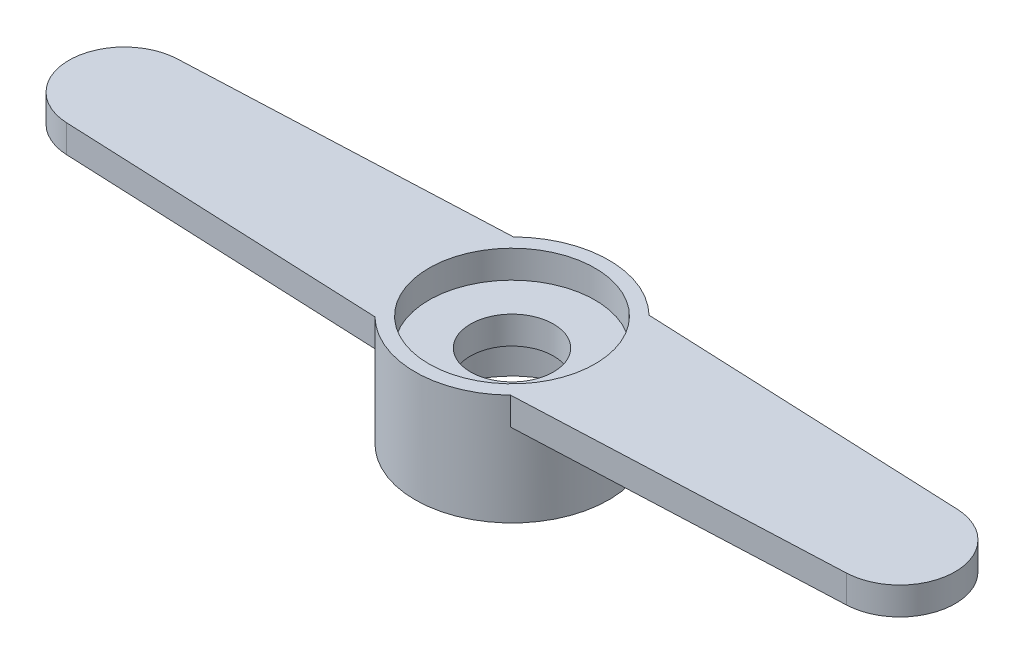
ISO-10303-21;
HEADER;
FILE_DESCRIPTION(('STEP AP214'),'2;1');
FILE_NAME('part.step','',(''),(''),'','','');
FILE_SCHEMA(('AUTOMOTIVE_DESIGN { 1 0 10303 214 1 1 1 1 }'));
ENDSEC;
DATA;
#1=APPLICATION_CONTEXT('core data for automotive mechanical design processes');
#2=APPLICATION_PROTOCOL_DEFINITION('international standard','automotive_design',2000,#1);
#3=PRODUCT_CONTEXT('',#1,'mechanical');
#4=PRODUCT('Part','Part','',(#3));
#5=PRODUCT_RELATED_PRODUCT_CATEGORY('part','',(#4));
#6=PRODUCT_DEFINITION_FORMATION('','',#4);
#7=PRODUCT_DEFINITION_CONTEXT('part definition',#1,'design');
#8=PRODUCT_DEFINITION('design','',#6,#7);
#9=PRODUCT_DEFINITION_SHAPE('','',#8);
#10=(LENGTH_UNIT() NAMED_UNIT(*) SI_UNIT(.MILLI.,.METRE.));
#11=(NAMED_UNIT(*) PLANE_ANGLE_UNIT() SI_UNIT($,.RADIAN.));
#12=(NAMED_UNIT(*) SI_UNIT($,.STERADIAN.) SOLID_ANGLE_UNIT());
#13=UNCERTAINTY_MEASURE_WITH_UNIT(LENGTH_MEASURE(1.E-05),#10,'distance_accuracy_value','');
#14=(GEOMETRIC_REPRESENTATION_CONTEXT(3) GLOBAL_UNCERTAINTY_ASSIGNED_CONTEXT((#13)) GLOBAL_UNIT_ASSIGNED_CONTEXT((#10,
#11,#12)) REPRESENTATION_CONTEXT('',''));
#15=CARTESIAN_POINT('',(0.,0.,0.));
#16=DIRECTION('',(0.,0.,1.));
#17=DIRECTION('',(1.,0.,0.));
#18=AXIS2_PLACEMENT_3D('',#15,#16,#17);
#19=CARTESIAN_POINT('',(0.,4.,0.));
#20=DIRECTION('',(0.,-1.,0.));
#21=DIRECTION('',(0.,0.,-1.));
#22=AXIS2_PLACEMENT_3D('',#19,#20,#21);
#23=CYLINDRICAL_SURFACE('',#22,3.5);
#24=CARTESIAN_POINT('',(0.,0.,0.));
#25=DIRECTION('',(0.,1.,0.));
#26=DIRECTION('',(0.,0.,1.));
#27=AXIS2_PLACEMENT_3D('',#24,#25,#26);
#28=CIRCLE('',#27,3.5);
#29=CARTESIAN_POINT('',(0.,0.,3.5));
#30=VERTEX_POINT('',#29);
#31=EDGE_CURVE('E177',#30,#30,#28,.T.);
#32=ORIENTED_EDGE('',*,*,#31,.T.);
#33=EDGE_LOOP('',(#32));
#34=FACE_BOUND('',#33,.T.);
#35=DIRECTION('',(0.,1.,0.));
#36=VECTOR('',#35,1.);
#37=CARTESIAN_POINT('',(2.44948974278318,3.,2.5));
#38=LINE('',#37,#36);
#39=CARTESIAN_POINT('',(2.44948974278318,3.,2.5));
#40=VERTEX_POINT('',#39);
#41=CARTESIAN_POINT('',(2.44948974278318,4.,2.5));
#42=VERTEX_POINT('',#41);
#43=EDGE_CURVE('E125',#40,#42,#38,.T.);
#44=ORIENTED_EDGE('',*,*,#43,.T.);
#45=CARTESIAN_POINT('',(0.,4.,0.));
#46=DIRECTION('',(0.,1.,0.));
#47=DIRECTION('',(0.,0.,1.));
#48=AXIS2_PLACEMENT_3D('',#45,#46,#47);
#49=CIRCLE('',#48,3.5);
#50=CARTESIAN_POINT('',(-2.44948974278318,4.,2.5));
#51=VERTEX_POINT('',#50);
#52=EDGE_CURVE('E11',#51,#42,#49,.T.);
#53=ORIENTED_EDGE('',*,*,#52,.F.);
#54=DIRECTION('',(0.,1.,0.));
#55=VECTOR('',#54,1.);
#56=CARTESIAN_POINT('',(-2.44948974278318,3.,2.5));
#57=LINE('',#56,#55);
#58=CARTESIAN_POINT('',(-2.44948974278318,3.,2.5));
#59=VERTEX_POINT('',#58);
#60=EDGE_CURVE('E160',#59,#51,#57,.T.);
#61=ORIENTED_EDGE('',*,*,#60,.F.);
#62=CARTESIAN_POINT('',(0.,3.,0.));
#63=DIRECTION('',(0.,1.,0.));
#64=DIRECTION('',(0.,0.,1.));
#65=AXIS2_PLACEMENT_3D('',#62,#63,#64);
#66=CIRCLE('',#65,3.5);
#67=CARTESIAN_POINT('',(-2.44948974278318,3.,-2.5));
#68=VERTEX_POINT('',#67);
#69=EDGE_CURVE('E148',#68,#59,#66,.T.);
#70=ORIENTED_EDGE('',*,*,#69,.F.);
#71=DIRECTION('',(0.,1.,0.));
#72=VECTOR('',#71,1.);
#73=CARTESIAN_POINT('',(-2.44948974278318,3.,-2.5));
#74=LINE('',#73,#72);
#75=CARTESIAN_POINT('',(-2.44948974278318,4.,-2.5));
#76=VERTEX_POINT('',#75);
#77=EDGE_CURVE('E156',#68,#76,#74,.T.);
#78=ORIENTED_EDGE('',*,*,#77,.T.);
#79=CARTESIAN_POINT('',(2.44948974278318,4.,-2.5));
#80=VERTEX_POINT('',#79);
#81=EDGE_CURVE('E45',#80,#76,#49,.T.);
#82=ORIENTED_EDGE('',*,*,#81,.F.);
#83=DIRECTION('',(0.,1.,0.));
#84=VECTOR('',#83,1.);
#85=CARTESIAN_POINT('',(2.44948974278318,3.,-2.5));
#86=LINE('',#85,#84);
#87=CARTESIAN_POINT('',(2.44948974278318,3.,-2.5));
#88=VERTEX_POINT('',#87);
#89=EDGE_CURVE('E137',#88,#80,#86,.T.);
#90=ORIENTED_EDGE('',*,*,#89,.F.);
#91=CARTESIAN_POINT('',(0.,3.,0.));
#92=DIRECTION('',(0.,1.,0.));
#93=DIRECTION('',(0.,0.,1.));
#94=AXIS2_PLACEMENT_3D('',#91,#92,#93);
#95=CIRCLE('',#94,3.5);
#96=EDGE_CURVE('E121',#40,#88,#95,.T.);
#97=ORIENTED_EDGE('',*,*,#96,.F.);
#98=EDGE_LOOP('',(#44,#53,#61,#70,#78,#82,#90,#97));
#99=FACE_BOUND('',#98,.T.);
#100=ADVANCED_FACE('F37',(#34,#99),#23,.T.);
#101=CARTESIAN_POINT('',(0.,4.,0.));
#102=DIRECTION('',(0.,-1.,0.));
#103=DIRECTION('',(0.,0.,-1.));
#104=AXIS2_PLACEMENT_3D('',#101,#102,#103);
#105=CYLINDRICAL_SURFACE('',#104,1.5);
#106=CARTESIAN_POINT('',(0.,2.,0.));
#107=DIRECTION('',(0.,-1.,0.));
#108=DIRECTION('',(0.,0.,-1.));
#109=AXIS2_PLACEMENT_3D('',#106,#107,#108);
#110=CIRCLE('',#109,1.5);
#111=CARTESIAN_POINT('',(0.,2.,-1.5));
#112=VERTEX_POINT('',#111);
#113=EDGE_CURVE('E173',#112,#112,#110,.T.);
#114=ORIENTED_EDGE('',*,*,#113,.T.);
#115=EDGE_LOOP('',(#114));
#116=FACE_BOUND('',#115,.T.);
#117=CARTESIAN_POINT('',(0.,3.,0.));
#118=DIRECTION('',(0.,1.,0.));
#119=DIRECTION('',(0.,0.,1.));
#120=AXIS2_PLACEMENT_3D('',#117,#118,#119);
#121=CIRCLE('',#120,1.5);
#122=CARTESIAN_POINT('',(0.,3.,1.5));
#123=VERTEX_POINT('',#122);
#124=EDGE_CURVE('E40',#123,#123,#121,.T.);
#125=ORIENTED_EDGE('',*,*,#124,.T.);
#126=EDGE_LOOP('',(#125));
#127=FACE_BOUND('',#126,.T.);
#128=ADVANCED_FACE('F182',(#116,#127),#105,.F.);
#129=CARTESIAN_POINT('',(0.,4.,0.));
#130=DIRECTION('',(0.,1.,0.));
#131=DIRECTION('',(0.,0.,1.));
#132=AXIS2_PLACEMENT_3D('',#129,#130,#131);
#133=PLANE('',#132);
#134=CARTESIAN_POINT('',(0.,4.,0.));
#135=DIRECTION('',(0.,1.,0.));
#136=DIRECTION('',(0.,0.,1.));
#137=AXIS2_PLACEMENT_3D('',#134,#135,#136);
#138=CIRCLE('',#137,3.);
#139=CARTESIAN_POINT('',(0.,4.,3.));
#140=VERTEX_POINT('',#139);
#141=EDGE_CURVE('E159',#140,#140,#138,.T.);
#142=ORIENTED_EDGE('',*,*,#141,.F.);
#143=EDGE_LOOP('',(#142));
#144=FACE_BOUND('',#143,.T.);
#145=ORIENTED_EDGE('',*,*,#52,.T.);
#146=DIRECTION('',(-0.999071318541253,0.,0.0430871264792981));
#147=VECTOR('',#146,1.);
#148=CARTESIAN_POINT('',(0.112165259513999,4.,2.60080220877607));
#149=LINE('',#148,#147);
#150=CARTESIAN_POINT('',(14.0861742529586,4.,1.99814263708251));
#151=VERTEX_POINT('',#150);
#152=EDGE_CURVE('E132',#151,#42,#149,.T.);
#153=ORIENTED_EDGE('',*,*,#152,.F.);
#154=CARTESIAN_POINT('',(14.,4.,0.));
#155=DIRECTION('',(0.,1.,0.));
#156=DIRECTION('',(0.,0.,1.));
#157=AXIS2_PLACEMENT_3D('',#154,#155,#156);
#158=CIRCLE('',#157,2.);
#159=CARTESIAN_POINT('',(14.0861742529586,4.,-1.99814263708251));
#160=VERTEX_POINT('',#159);
#161=EDGE_CURVE('E117',#160,#151,#158,.F.);
#162=ORIENTED_EDGE('',*,*,#161,.F.);
#163=DIRECTION('',(-0.999071318541253,0.,-0.0430871264792981));
#164=VECTOR('',#163,1.);
#165=CARTESIAN_POINT('',(0.112165259513999,4.,-2.60080220877607));
#166=LINE('',#165,#164);
#167=EDGE_CURVE('E53',#160,#80,#166,.T.);
#168=ORIENTED_EDGE('',*,*,#167,.T.);
#169=ORIENTED_EDGE('',*,*,#81,.T.);
#170=DIRECTION('',(0.999071318541253,0.,-0.0430871264792981));
#171=VECTOR('',#170,1.);
#172=CARTESIAN_POINT('',(-0.112165259513999,4.,-2.60080220877607));
#173=LINE('',#172,#171);
#174=CARTESIAN_POINT('',(-14.0861742529586,4.,-1.99814263708251));
#175=VERTEX_POINT('',#174);
#176=EDGE_CURVE('E136',#175,#76,#173,.T.);
#177=ORIENTED_EDGE('',*,*,#176,.F.);
#178=CARTESIAN_POINT('',(-14.,4.,0.));
#179=DIRECTION('',(0.,1.,0.));
#180=DIRECTION('',(0.,0.,1.));
#181=AXIS2_PLACEMENT_3D('',#178,#179,#180);
#182=CIRCLE('',#181,2.);
#183=CARTESIAN_POINT('',(-14.0861742529586,4.,1.99814263708251));
#184=VERTEX_POINT('',#183);
#185=EDGE_CURVE('E153',#175,#184,#182,.T.);
#186=ORIENTED_EDGE('',*,*,#185,.T.);
#187=DIRECTION('',(0.999071318541253,0.,0.0430871264792981));
#188=VECTOR('',#187,1.);
#189=CARTESIAN_POINT('',(-0.112165259513999,4.,2.60080220877607));
#190=LINE('',#189,#188);
#191=EDGE_CURVE('E59',#184,#51,#190,.T.);
#192=ORIENTED_EDGE('',*,*,#191,.T.);
#193=EDGE_LOOP('',(#145,#153,#162,#168,#169,#177,#186,#192));
#194=FACE_BOUND('',#193,.T.);
#195=ADVANCED_FACE('F201',(#144,#194),#133,.T.);
#196=CARTESIAN_POINT('',(0.,0.,0.));
#197=DIRECTION('',(0.,1.,0.));
#198=DIRECTION('',(0.,0.,1.));
#199=AXIS2_PLACEMENT_3D('',#196,#197,#198);
#200=PLANE('',#199);
#201=CARTESIAN_POINT('',(0.,0.,0.));
#202=DIRECTION('',(0.,-1.,0.));
#203=DIRECTION('',(0.,0.,-1.));
#204=AXIS2_PLACEMENT_3D('',#201,#202,#203);
#205=CIRCLE('',#204,3.);
#206=CARTESIAN_POINT('',(0.,0.,-3.));
#207=VERTEX_POINT('',#206);
#208=EDGE_CURVE('E174',#207,#207,#205,.T.);
#209=ORIENTED_EDGE('',*,*,#208,.F.);
#210=EDGE_LOOP('',(#209));
#211=FACE_BOUND('',#210,.T.);
#212=ORIENTED_EDGE('',*,*,#31,.F.);
#213=EDGE_LOOP('',(#212));
#214=FACE_BOUND('',#213,.T.);
#215=ADVANCED_FACE('F195',(#211,#214),#200,.F.);
#216=CARTESIAN_POINT('',(0.,2.,0.));
#217=DIRECTION('',(0.,-1.,0.));
#218=DIRECTION('',(0.,0.,-1.));
#219=AXIS2_PLACEMENT_3D('',#216,#217,#218);
#220=CYLINDRICAL_SURFACE('',#219,3.);
#221=CARTESIAN_POINT('',(0.,2.,0.));
#222=DIRECTION('',(0.,-1.,0.));
#223=DIRECTION('',(0.,0.,-1.));
#224=AXIS2_PLACEMENT_3D('',#221,#222,#223);
#225=CIRCLE('',#224,3.);
#226=CARTESIAN_POINT('',(0.,2.,-3.));
#227=VERTEX_POINT('',#226);
#228=EDGE_CURVE('E170',#227,#227,#225,.T.);
#229=ORIENTED_EDGE('',*,*,#228,.F.);
#230=EDGE_LOOP('',(#229));
#231=FACE_BOUND('',#230,.T.);
#232=ORIENTED_EDGE('',*,*,#208,.T.);
#233=EDGE_LOOP('',(#232));
#234=FACE_BOUND('',#233,.T.);
#235=ADVANCED_FACE('F189',(#231,#234),#220,.F.);
#236=CARTESIAN_POINT('',(0.,2.,0.));
#237=DIRECTION('',(0.,-1.,0.));
#238=DIRECTION('',(0.,0.,-1.));
#239=AXIS2_PLACEMENT_3D('',#236,#237,#238);
#240=PLANE('',#239);
#241=ORIENTED_EDGE('',*,*,#113,.F.);
#242=EDGE_LOOP('',(#241));
#243=FACE_BOUND('',#242,.T.);
#244=ORIENTED_EDGE('',*,*,#228,.T.);
#245=EDGE_LOOP('',(#244));
#246=FACE_BOUND('',#245,.T.);
#247=ADVANCED_FACE('F185',(#243,#246),#240,.T.);
#248=CARTESIAN_POINT('',(0.,3.,0.));
#249=DIRECTION('',(0.,1.,0.));
#250=DIRECTION('',(0.,0.,1.));
#251=AXIS2_PLACEMENT_3D('',#248,#249,#250);
#252=CYLINDRICAL_SURFACE('',#251,3.);
#253=CARTESIAN_POINT('',(0.,3.,0.));
#254=DIRECTION('',(0.,1.,0.));
#255=DIRECTION('',(0.,0.,1.));
#256=AXIS2_PLACEMENT_3D('',#253,#254,#255);
#257=CIRCLE('',#256,3.);
#258=CARTESIAN_POINT('',(0.,3.,3.));
#259=VERTEX_POINT('',#258);
#260=EDGE_CURVE('E165',#259,#259,#257,.T.);
#261=ORIENTED_EDGE('',*,*,#260,.F.);
#262=EDGE_LOOP('',(#261));
#263=FACE_BOUND('',#262,.T.);
#264=ORIENTED_EDGE('',*,*,#141,.T.);
#265=EDGE_LOOP('',(#264));
#266=FACE_BOUND('',#265,.T.);
#267=ADVANCED_FACE('F188',(#263,#266),#252,.F.);
#268=CARTESIAN_POINT('',(0.,3.,0.));
#269=DIRECTION('',(0.,1.,0.));
#270=DIRECTION('',(0.,0.,1.));
#271=AXIS2_PLACEMENT_3D('',#268,#269,#270);
#272=PLANE('',#271);
#273=ORIENTED_EDGE('',*,*,#124,.F.);
#274=EDGE_LOOP('',(#273));
#275=FACE_BOUND('',#274,.T.);
#276=ORIENTED_EDGE('',*,*,#260,.T.);
#277=EDGE_LOOP('',(#276));
#278=FACE_BOUND('',#277,.T.);
#279=ADVANCED_FACE('F241',(#275,#278),#272,.T.);
#280=CARTESIAN_POINT('',(-0.112165259513999,3.,-2.60080220877607));
#281=DIRECTION('',(0.0430871264792981,0.,0.999071318541253));
#282=DIRECTION('',(0.999071318541253,0.,-0.0430871264792981));
#283=AXIS2_PLACEMENT_3D('',#280,#281,#282);
#284=PLANE('',#283);
#285=ORIENTED_EDGE('',*,*,#176,.T.);
#286=ORIENTED_EDGE('',*,*,#77,.F.);
#287=DIRECTION('',(0.999071318541253,0.,-0.0430871264792981));
#288=VECTOR('',#287,1.);
#289=CARTESIAN_POINT('',(-0.112165259513999,3.,-2.60080220877607));
#290=LINE('',#289,#288);
#291=CARTESIAN_POINT('',(-14.0861742529586,3.,-1.99814263708251));
#292=VERTEX_POINT('',#291);
#293=EDGE_CURVE('E140',#292,#68,#290,.T.);
#294=ORIENTED_EDGE('',*,*,#293,.F.);
#295=DIRECTION('',(0.,1.,0.));
#296=VECTOR('',#295,1.);
#297=CARTESIAN_POINT('',(-14.0861742529586,3.,-1.99814263708251));
#298=LINE('',#297,#296);
#299=EDGE_CURVE('E150',#292,#175,#298,.T.);
#300=ORIENTED_EDGE('',*,*,#299,.T.);
#301=EDGE_LOOP('',(#285,#286,#294,#300));
#302=FACE_BOUND('',#301,.T.);
#303=ADVANCED_FACE('F217',(#302),#284,.F.);
#304=CARTESIAN_POINT('',(-0.112165259513999,3.,2.60080220877607));
#305=DIRECTION('',(-0.0430871264792981,0.,0.999071318541253));
#306=DIRECTION('',(0.999071318541253,0.,0.0430871264792981));
#307=AXIS2_PLACEMENT_3D('',#304,#305,#306);
#308=PLANE('',#307);
#309=ORIENTED_EDGE('',*,*,#191,.F.);
#310=DIRECTION('',(0.,1.,0.));
#311=VECTOR('',#310,1.);
#312=CARTESIAN_POINT('',(-14.0861742529586,3.,1.99814263708251));
#313=LINE('',#312,#311);
#314=CARTESIAN_POINT('',(-14.0861742529586,3.,1.99814263708251));
#315=VERTEX_POINT('',#314);
#316=EDGE_CURVE('E162',#315,#184,#313,.T.);
#317=ORIENTED_EDGE('',*,*,#316,.F.);
#318=DIRECTION('',(0.999071318541253,0.,0.0430871264792981));
#319=VECTOR('',#318,1.);
#320=CARTESIAN_POINT('',(-0.112165259513999,3.,2.60080220877607));
#321=LINE('',#320,#319);
#322=EDGE_CURVE('E145',#315,#59,#321,.T.);
#323=ORIENTED_EDGE('',*,*,#322,.T.);
#324=ORIENTED_EDGE('',*,*,#60,.T.);
#325=EDGE_LOOP('',(#309,#317,#323,#324));
#326=FACE_BOUND('',#325,.T.);
#327=ADVANCED_FACE('F224',(#326),#308,.T.);
#328=CARTESIAN_POINT('',(-14.,3.,0.));
#329=DIRECTION('',(0.,1.,0.));
#330=DIRECTION('',(0.,0.,1.));
#331=AXIS2_PLACEMENT_3D('',#328,#329,#330);
#332=CYLINDRICAL_SURFACE('',#331,2.);
#333=ORIENTED_EDGE('',*,*,#185,.F.);
#334=ORIENTED_EDGE('',*,*,#299,.F.);
#335=CARTESIAN_POINT('',(-14.,3.,0.));
#336=DIRECTION('',(0.,1.,0.));
#337=DIRECTION('',(0.,0.,1.));
#338=AXIS2_PLACEMENT_3D('',#335,#336,#337);
#339=CIRCLE('',#338,2.);
#340=EDGE_CURVE('E142',#292,#315,#339,.T.);
#341=ORIENTED_EDGE('',*,*,#340,.T.);
#342=ORIENTED_EDGE('',*,*,#316,.T.);
#343=EDGE_LOOP('',(#333,#334,#341,#342));
#344=FACE_BOUND('',#343,.T.);
#345=ADVANCED_FACE('F221',(#344),#332,.T.);
#346=CARTESIAN_POINT('',(0.,3.,0.));
#347=DIRECTION('',(0.,1.,0.));
#348=DIRECTION('',(0.,0.,1.));
#349=AXIS2_PLACEMENT_3D('',#346,#347,#348);
#350=PLANE('',#349);
#351=ORIENTED_EDGE('',*,*,#293,.T.);
#352=ORIENTED_EDGE('',*,*,#69,.T.);
#353=ORIENTED_EDGE('',*,*,#322,.F.);
#354=ORIENTED_EDGE('',*,*,#340,.F.);
#355=EDGE_LOOP('',(#351,#352,#353,#354));
#356=FACE_BOUND('',#355,.T.);
#357=ADVANCED_FACE('F226',(#356),#350,.F.);
#358=CARTESIAN_POINT('',(0.112165259513999,3.,2.60080220877607));
#359=DIRECTION('',(-0.0430871264792981,0.,-0.999071318541253));
#360=DIRECTION('',(-0.999071318541253,0.,0.0430871264792981));
#361=AXIS2_PLACEMENT_3D('',#358,#359,#360);
#362=PLANE('',#361);
#363=ORIENTED_EDGE('',*,*,#152,.T.);
#364=ORIENTED_EDGE('',*,*,#43,.F.);
#365=DIRECTION('',(-0.999071318541253,0.,0.0430871264792981));
#366=VECTOR('',#365,1.);
#367=CARTESIAN_POINT('',(0.112165259513999,3.,2.60080220877607));
#368=LINE('',#367,#366);
#369=CARTESIAN_POINT('',(14.0861742529586,3.,1.99814263708251));
#370=VERTEX_POINT('',#369);
#371=EDGE_CURVE('E108',#370,#40,#368,.T.);
#372=ORIENTED_EDGE('',*,*,#371,.F.);
#373=DIRECTION('',(0.,1.,0.));
#374=VECTOR('',#373,1.);
#375=CARTESIAN_POINT('',(14.0861742529586,3.,1.99814263708251));
#376=LINE('',#375,#374);
#377=EDGE_CURVE('E115',#370,#151,#376,.T.);
#378=ORIENTED_EDGE('',*,*,#377,.T.);
#379=EDGE_LOOP('',(#363,#364,#372,#378));
#380=FACE_BOUND('',#379,.T.);
#381=ADVANCED_FACE('F123',(#380),#362,.F.);
#382=CARTESIAN_POINT('',(0.112165259513999,3.,-2.60080220877607));
#383=DIRECTION('',(0.0430871264792981,0.,-0.999071318541253));
#384=DIRECTION('',(-0.999071318541253,0.,-0.0430871264792981));
#385=AXIS2_PLACEMENT_3D('',#382,#383,#384);
#386=PLANE('',#385);
#387=ORIENTED_EDGE('',*,*,#167,.F.);
#388=DIRECTION('',(0.,1.,0.));
#389=VECTOR('',#388,1.);
#390=CARTESIAN_POINT('',(14.0861742529586,3.,-1.99814263708251));
#391=LINE('',#390,#389);
#392=CARTESIAN_POINT('',(14.0861742529586,3.,-1.99814263708251));
#393=VERTEX_POINT('',#392);
#394=EDGE_CURVE('E120',#393,#160,#391,.T.);
#395=ORIENTED_EDGE('',*,*,#394,.F.);
#396=DIRECTION('',(-0.999071318541253,0.,-0.0430871264792981));
#397=VECTOR('',#396,1.);
#398=CARTESIAN_POINT('',(0.112165259513999,3.,-2.60080220877607));
#399=LINE('',#398,#397);
#400=EDGE_CURVE('E111',#393,#88,#399,.T.);
#401=ORIENTED_EDGE('',*,*,#400,.T.);
#402=ORIENTED_EDGE('',*,*,#89,.T.);
#403=EDGE_LOOP('',(#387,#395,#401,#402));
#404=FACE_BOUND('',#403,.T.);
#405=ADVANCED_FACE('F210',(#404),#386,.T.);
#406=CARTESIAN_POINT('',(14.,3.,0.));
#407=DIRECTION('',(0.,1.,0.));
#408=DIRECTION('',(0.,0.,1.));
#409=AXIS2_PLACEMENT_3D('',#406,#407,#408);
#410=CYLINDRICAL_SURFACE('',#409,2.);
#411=ORIENTED_EDGE('',*,*,#161,.T.);
#412=ORIENTED_EDGE('',*,*,#377,.F.);
#413=CARTESIAN_POINT('',(14.,3.,0.));
#414=DIRECTION('',(0.,1.,0.));
#415=DIRECTION('',(0.,0.,1.));
#416=AXIS2_PLACEMENT_3D('',#413,#414,#415);
#417=CIRCLE('',#416,2.);
#418=EDGE_CURVE('E104',#393,#370,#417,.F.);
#419=ORIENTED_EDGE('',*,*,#418,.F.);
#420=ORIENTED_EDGE('',*,*,#394,.T.);
#421=EDGE_LOOP('',(#411,#412,#419,#420));
#422=FACE_BOUND('',#421,.T.);
#423=ADVANCED_FACE('F116',(#422),#410,.T.);
#424=CARTESIAN_POINT('',(0.,3.,0.));
#425=DIRECTION('',(0.,1.,0.));
#426=DIRECTION('',(0.,0.,1.));
#427=AXIS2_PLACEMENT_3D('',#424,#425,#426);
#428=PLANE('',#427);
#429=ORIENTED_EDGE('',*,*,#371,.T.);
#430=ORIENTED_EDGE('',*,*,#96,.T.);
#431=ORIENTED_EDGE('',*,*,#400,.F.);
#432=ORIENTED_EDGE('',*,*,#418,.T.);
#433=EDGE_LOOP('',(#429,#430,#431,#432));
#434=FACE_BOUND('',#433,.T.);
#435=ADVANCED_FACE('F106',(#434),#428,.F.);
#436=CLOSED_SHELL('',(#100,#128,#195,#215,#235,#247,#267,#279,#303,#327,#345,#357,#381,#405,
#423,#435));
#437=MANIFOLD_SOLID_BREP('B2',#436);
#438=ADVANCED_BREP_SHAPE_REPRESENTATION('',(#18,#437),#14);
#439=SHAPE_DEFINITION_REPRESENTATION(#9,#438);
ENDSEC;
END-ISO-10303-21;
